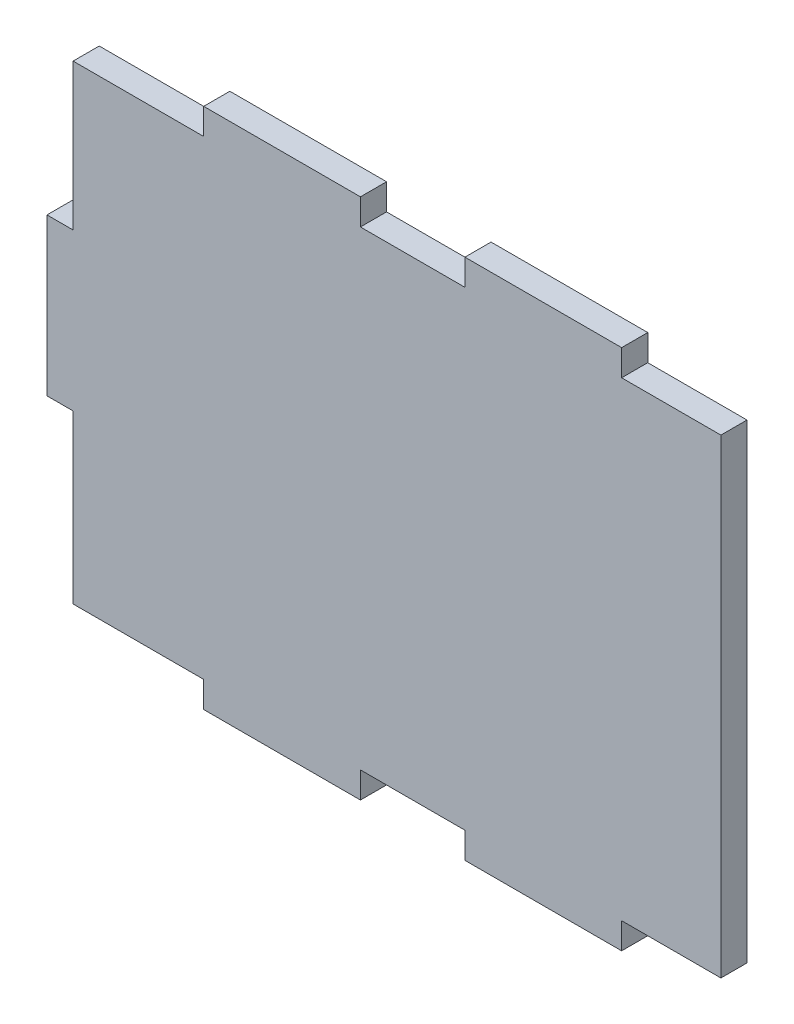
ISO-10303-21;
HEADER;
FILE_DESCRIPTION(('STEP AP214'),'2;1');
FILE_NAME('part.step','',(''),(''),'','','');
FILE_SCHEMA(('AUTOMOTIVE_DESIGN { 1 0 10303 214 1 1 1 1 }'));
ENDSEC;
DATA;
#1=APPLICATION_CONTEXT('core data for automotive mechanical design processes');
#2=APPLICATION_PROTOCOL_DEFINITION('international standard','automotive_design',2000,#1);
#3=PRODUCT_CONTEXT('',#1,'mechanical');
#4=PRODUCT('Part','Part','',(#3));
#5=PRODUCT_RELATED_PRODUCT_CATEGORY('part','',(#4));
#6=PRODUCT_DEFINITION_FORMATION('','',#4);
#7=PRODUCT_DEFINITION_CONTEXT('part definition',#1,'design');
#8=PRODUCT_DEFINITION('design','',#6,#7);
#9=PRODUCT_DEFINITION_SHAPE('','',#8);
#10=(LENGTH_UNIT() NAMED_UNIT(*) SI_UNIT(.MILLI.,.METRE.));
#11=(NAMED_UNIT(*) PLANE_ANGLE_UNIT() SI_UNIT($,.RADIAN.));
#12=(NAMED_UNIT(*) SI_UNIT($,.STERADIAN.) SOLID_ANGLE_UNIT());
#13=UNCERTAINTY_MEASURE_WITH_UNIT(LENGTH_MEASURE(1.E-05),#10,'distance_accuracy_value','');
#14=(GEOMETRIC_REPRESENTATION_CONTEXT(3) GLOBAL_UNCERTAINTY_ASSIGNED_CONTEXT((#13)) GLOBAL_UNIT_ASSIGNED_CONTEXT((#10,
#11,#12)) REPRESENTATION_CONTEXT('',''));
#15=CARTESIAN_POINT('',(0.,0.,0.));
#16=DIRECTION('',(0.,0.,1.));
#17=DIRECTION('',(1.,0.,0.));
#18=AXIS2_PLACEMENT_3D('',#15,#16,#17);
#19=CARTESIAN_POINT('',(-124.,155.000000000001,5.));
#20=DIRECTION('',(0.,1.,0.));
#21=DIRECTION('',(0.,0.,1.));
#22=AXIS2_PLACEMENT_3D('',#19,#20,#21);
#23=PLANE('',#22);
#24=DIRECTION('',(1.,0.,0.));
#25=VECTOR('',#24,1.);
#26=CARTESIAN_POINT('',(-124.,155.000000000001,0.));
#27=LINE('',#26,#25);
#28=CARTESIAN_POINT('',(-124.,155.000000000001,0.));
#29=VERTEX_POINT('',#28);
#30=CARTESIAN_POINT('',(-99.,155.000000000001,0.));
#31=VERTEX_POINT('',#30);
#32=EDGE_CURVE('E240',#29,#31,#27,.T.);
#33=ORIENTED_EDGE('',*,*,#32,.T.);
#34=DIRECTION('',(0.,0.,-1.));
#35=VECTOR('',#34,1.);
#36=CARTESIAN_POINT('',(-99.,155.000000000001,5.));
#37=LINE('',#36,#35);
#38=CARTESIAN_POINT('',(-99.,155.000000000001,5.));
#39=VERTEX_POINT('',#38);
#40=EDGE_CURVE('E11',#39,#31,#37,.T.);
#41=ORIENTED_EDGE('',*,*,#40,.F.);
#42=DIRECTION('',(1.,0.,0.));
#43=VECTOR('',#42,1.);
#44=CARTESIAN_POINT('',(-124.,155.000000000001,5.));
#45=LINE('',#44,#43);
#46=CARTESIAN_POINT('',(-124.,155.000000000001,5.));
#47=VERTEX_POINT('',#46);
#48=EDGE_CURVE('E310',#47,#39,#45,.T.);
#49=ORIENTED_EDGE('',*,*,#48,.F.);
#50=DIRECTION('',(0.,0.,-1.));
#51=VECTOR('',#50,1.);
#52=CARTESIAN_POINT('',(-124.,155.000000000001,5.));
#53=LINE('',#52,#51);
#54=EDGE_CURVE('E236',#47,#29,#53,.T.);
#55=ORIENTED_EDGE('',*,*,#54,.T.);
#56=EDGE_LOOP('',(#33,#41,#49,#55));
#57=FACE_BOUND('',#56,.T.);
#58=ADVANCED_FACE('F43',(#57),#23,.F.);
#59=CARTESIAN_POINT('',(-99.,155.000000000001,5.));
#60=DIRECTION('',(1.,0.,0.));
#61=DIRECTION('',(0.,0.,-1.));
#62=AXIS2_PLACEMENT_3D('',#59,#60,#61);
#63=PLANE('',#62);
#64=DIRECTION('',(0.,-1.,0.));
#65=VECTOR('',#64,1.);
#66=CARTESIAN_POINT('',(-99.,155.000000000001,0.));
#67=LINE('',#66,#65);
#68=CARTESIAN_POINT('',(-99.,150.000000000001,0.));
#69=VERTEX_POINT('',#68);
#70=EDGE_CURVE('E244',#31,#69,#67,.T.);
#71=ORIENTED_EDGE('',*,*,#70,.T.);
#72=DIRECTION('',(0.,0.,-1.));
#73=VECTOR('',#72,1.);
#74=CARTESIAN_POINT('',(-99.,150.000000000001,5.));
#75=LINE('',#74,#73);
#76=CARTESIAN_POINT('',(-99.,150.000000000001,5.));
#77=VERTEX_POINT('',#76);
#78=EDGE_CURVE('E52',#77,#69,#75,.T.);
#79=ORIENTED_EDGE('',*,*,#78,.F.);
#80=DIRECTION('',(0.,-1.,0.));
#81=VECTOR('',#80,1.);
#82=CARTESIAN_POINT('',(-99.,155.000000000001,5.));
#83=LINE('',#82,#81);
#84=EDGE_CURVE('E151',#39,#77,#83,.T.);
#85=ORIENTED_EDGE('',*,*,#84,.F.);
#86=ORIENTED_EDGE('',*,*,#40,.T.);
#87=EDGE_LOOP('',(#71,#79,#85,#86));
#88=FACE_BOUND('',#87,.T.);
#89=ADVANCED_FACE('F488',(#88),#63,.F.);
#90=CARTESIAN_POINT('',(-99.,150.000000000001,5.));
#91=DIRECTION('',(0.,1.,0.));
#92=DIRECTION('',(0.,0.,1.));
#93=AXIS2_PLACEMENT_3D('',#90,#91,#92);
#94=PLANE('',#93);
#95=DIRECTION('',(1.,0.,0.));
#96=VECTOR('',#95,1.);
#97=CARTESIAN_POINT('',(-99.,150.000000000001,0.));
#98=LINE('',#97,#96);
#99=CARTESIAN_POINT('',(-69.,150.000000000001,0.));
#100=VERTEX_POINT('',#99);
#101=EDGE_CURVE('E247',#69,#100,#98,.T.);
#102=ORIENTED_EDGE('',*,*,#101,.T.);
#103=DIRECTION('',(0.,0.,-1.));
#104=VECTOR('',#103,1.);
#105=CARTESIAN_POINT('',(-69.,150.000000000001,5.));
#106=LINE('',#105,#104);
#107=CARTESIAN_POINT('',(-69.,150.000000000001,5.));
#108=VERTEX_POINT('',#107);
#109=EDGE_CURVE('E385',#108,#100,#106,.T.);
#110=ORIENTED_EDGE('',*,*,#109,.F.);
#111=DIRECTION('',(1.,0.,0.));
#112=VECTOR('',#111,1.);
#113=CARTESIAN_POINT('',(-99.,150.000000000001,5.));
#114=LINE('',#113,#112);
#115=EDGE_CURVE('E395',#77,#108,#114,.T.);
#116=ORIENTED_EDGE('',*,*,#115,.F.);
#117=ORIENTED_EDGE('',*,*,#78,.T.);
#118=EDGE_LOOP('',(#102,#110,#116,#117));
#119=FACE_BOUND('',#118,.T.);
#120=ADVANCED_FACE('F393',(#119),#94,.F.);
#121=CARTESIAN_POINT('',(-69.,150.000000000001,5.));
#122=DIRECTION('',(-1.,0.,0.));
#123=DIRECTION('',(0.,0.,1.));
#124=AXIS2_PLACEMENT_3D('',#121,#122,#123);
#125=PLANE('',#124);
#126=DIRECTION('',(0.,1.,0.));
#127=VECTOR('',#126,1.);
#128=CARTESIAN_POINT('',(-69.,150.000000000001,0.));
#129=LINE('',#128,#127);
#130=CARTESIAN_POINT('',(-69.,155.000000000001,0.));
#131=VERTEX_POINT('',#130);
#132=EDGE_CURVE('E250',#100,#131,#129,.T.);
#133=ORIENTED_EDGE('',*,*,#132,.T.);
#134=DIRECTION('',(0.,0.,-1.));
#135=VECTOR('',#134,1.);
#136=CARTESIAN_POINT('',(-69.,155.000000000001,5.));
#137=LINE('',#136,#135);
#138=CARTESIAN_POINT('',(-69.,155.000000000001,5.));
#139=VERTEX_POINT('',#138);
#140=EDGE_CURVE('E381',#139,#131,#137,.T.);
#141=ORIENTED_EDGE('',*,*,#140,.F.);
#142=DIRECTION('',(0.,1.,0.));
#143=VECTOR('',#142,1.);
#144=CARTESIAN_POINT('',(-69.,150.000000000001,5.));
#145=LINE('',#144,#143);
#146=EDGE_CURVE('E414',#108,#139,#145,.T.);
#147=ORIENTED_EDGE('',*,*,#146,.F.);
#148=ORIENTED_EDGE('',*,*,#109,.T.);
#149=EDGE_LOOP('',(#133,#141,#147,#148));
#150=FACE_BOUND('',#149,.T.);
#151=ADVANCED_FACE('F404',(#150),#125,.F.);
#152=CARTESIAN_POINT('',(-69.,155.000000000001,5.));
#153=DIRECTION('',(0.,1.,0.));
#154=DIRECTION('',(0.,0.,1.));
#155=AXIS2_PLACEMENT_3D('',#152,#153,#154);
#156=PLANE('',#155);
#157=DIRECTION('',(1.,0.,0.));
#158=VECTOR('',#157,1.);
#159=CARTESIAN_POINT('',(-69.,155.000000000001,0.));
#160=LINE('',#159,#158);
#161=CARTESIAN_POINT('',(-49.,155.000000000001,0.));
#162=VERTEX_POINT('',#161);
#163=EDGE_CURVE('E253',#131,#162,#160,.T.);
#164=ORIENTED_EDGE('',*,*,#163,.T.);
#165=DIRECTION('',(0.,0.,-1.));
#166=VECTOR('',#165,1.);
#167=CARTESIAN_POINT('',(-49.,155.000000000001,5.));
#168=LINE('',#167,#166);
#169=CARTESIAN_POINT('',(-49.,155.000000000001,5.));
#170=VERTEX_POINT('',#169);
#171=EDGE_CURVE('E377',#170,#162,#168,.T.);
#172=ORIENTED_EDGE('',*,*,#171,.F.);
#173=DIRECTION('',(1.,0.,0.));
#174=VECTOR('',#173,1.);
#175=CARTESIAN_POINT('',(-69.,155.000000000001,5.));
#176=LINE('',#175,#174);
#177=EDGE_CURVE('E410',#139,#170,#176,.T.);
#178=ORIENTED_EDGE('',*,*,#177,.F.);
#179=ORIENTED_EDGE('',*,*,#140,.T.);
#180=EDGE_LOOP('',(#164,#172,#178,#179));
#181=FACE_BOUND('',#180,.T.);
#182=ADVANCED_FACE('F408',(#181),#156,.F.);
#183=CARTESIAN_POINT('',(-49.,155.000000000001,5.));
#184=DIRECTION('',(1.,0.,0.));
#185=DIRECTION('',(0.,0.,-1.));
#186=AXIS2_PLACEMENT_3D('',#183,#184,#185);
#187=PLANE('',#186);
#188=DIRECTION('',(0.,-1.,0.));
#189=VECTOR('',#188,1.);
#190=CARTESIAN_POINT('',(-49.,155.000000000001,0.));
#191=LINE('',#190,#189);
#192=CARTESIAN_POINT('',(-49.,150.000000000001,0.));
#193=VERTEX_POINT('',#192);
#194=EDGE_CURVE('E256',#162,#193,#191,.T.);
#195=ORIENTED_EDGE('',*,*,#194,.T.);
#196=DIRECTION('',(0.,0.,-1.));
#197=VECTOR('',#196,1.);
#198=CARTESIAN_POINT('',(-49.,150.000000000001,5.));
#199=LINE('',#198,#197);
#200=CARTESIAN_POINT('',(-49.,150.000000000001,5.));
#201=VERTEX_POINT('',#200);
#202=EDGE_CURVE('E373',#201,#193,#199,.T.);
#203=ORIENTED_EDGE('',*,*,#202,.F.);
#204=DIRECTION('',(0.,-1.,0.));
#205=VECTOR('',#204,1.);
#206=CARTESIAN_POINT('',(-49.,155.000000000001,5.));
#207=LINE('',#206,#205);
#208=EDGE_CURVE('E413',#170,#201,#207,.T.);
#209=ORIENTED_EDGE('',*,*,#208,.F.);
#210=ORIENTED_EDGE('',*,*,#171,.T.);
#211=EDGE_LOOP('',(#195,#203,#209,#210));
#212=FACE_BOUND('',#211,.T.);
#213=ADVANCED_FACE('F501',(#212),#187,.F.);
#214=CARTESIAN_POINT('',(-49.,150.000000000001,5.));
#215=DIRECTION('',(0.,1.,0.));
#216=DIRECTION('',(0.,0.,1.));
#217=AXIS2_PLACEMENT_3D('',#214,#215,#216);
#218=PLANE('',#217);
#219=DIRECTION('',(1.,0.,0.));
#220=VECTOR('',#219,1.);
#221=CARTESIAN_POINT('',(-49.,150.000000000001,0.));
#222=LINE('',#221,#220);
#223=CARTESIAN_POINT('',(-19.,150.000000000001,0.));
#224=VERTEX_POINT('',#223);
#225=EDGE_CURVE('E259',#193,#224,#222,.T.);
#226=ORIENTED_EDGE('',*,*,#225,.T.);
#227=DIRECTION('',(0.,0.,-1.));
#228=VECTOR('',#227,1.);
#229=CARTESIAN_POINT('',(-19.,150.000000000001,5.));
#230=LINE('',#229,#228);
#231=CARTESIAN_POINT('',(-19.,150.000000000001,5.));
#232=VERTEX_POINT('',#231);
#233=EDGE_CURVE('E369',#232,#224,#230,.T.);
#234=ORIENTED_EDGE('',*,*,#233,.F.);
#235=DIRECTION('',(1.,0.,0.));
#236=VECTOR('',#235,1.);
#237=CARTESIAN_POINT('',(-49.,150.000000000001,5.));
#238=LINE('',#237,#236);
#239=EDGE_CURVE('E418',#201,#232,#238,.T.);
#240=ORIENTED_EDGE('',*,*,#239,.F.);
#241=ORIENTED_EDGE('',*,*,#202,.T.);
#242=EDGE_LOOP('',(#226,#234,#240,#241));
#243=FACE_BOUND('',#242,.T.);
#244=ADVANCED_FACE('F504',(#243),#218,.F.);
#245=CARTESIAN_POINT('',(-19.,150.000000000001,5.));
#246=DIRECTION('',(-1.,0.,0.));
#247=DIRECTION('',(0.,0.,1.));
#248=AXIS2_PLACEMENT_3D('',#245,#246,#247);
#249=PLANE('',#248);
#250=DIRECTION('',(0.,1.,0.));
#251=VECTOR('',#250,1.);
#252=CARTESIAN_POINT('',(-19.,150.000000000001,0.));
#253=LINE('',#252,#251);
#254=CARTESIAN_POINT('',(-19.,155.000000000001,0.));
#255=VERTEX_POINT('',#254);
#256=EDGE_CURVE('E262',#224,#255,#253,.T.);
#257=ORIENTED_EDGE('',*,*,#256,.T.);
#258=DIRECTION('',(0.,0.,-1.));
#259=VECTOR('',#258,1.);
#260=CARTESIAN_POINT('',(-19.,155.000000000001,5.));
#261=LINE('',#260,#259);
#262=CARTESIAN_POINT('',(-19.,155.000000000001,5.));
#263=VERTEX_POINT('',#262);
#264=EDGE_CURVE('E365',#263,#255,#261,.T.);
#265=ORIENTED_EDGE('',*,*,#264,.F.);
#266=DIRECTION('',(0.,1.,0.));
#267=VECTOR('',#266,1.);
#268=CARTESIAN_POINT('',(-19.,150.000000000001,5.));
#269=LINE('',#268,#267);
#270=EDGE_CURVE('E425',#232,#263,#269,.T.);
#271=ORIENTED_EDGE('',*,*,#270,.F.);
#272=ORIENTED_EDGE('',*,*,#233,.T.);
#273=EDGE_LOOP('',(#257,#265,#271,#272));
#274=FACE_BOUND('',#273,.T.);
#275=ADVANCED_FACE('F508',(#274),#249,.F.);
#276=CARTESIAN_POINT('',(-19.,155.000000000001,5.));
#277=DIRECTION('',(0.,1.,0.));
#278=DIRECTION('',(0.,0.,1.));
#279=AXIS2_PLACEMENT_3D('',#276,#277,#278);
#280=PLANE('',#279);
#281=DIRECTION('',(1.,0.,0.));
#282=VECTOR('',#281,1.);
#283=CARTESIAN_POINT('',(-19.,155.000000000001,0.));
#284=LINE('',#283,#282);
#285=CARTESIAN_POINT('',(0.,155.000000000001,0.));
#286=VERTEX_POINT('',#285);
#287=EDGE_CURVE('E265',#255,#286,#284,.T.);
#288=ORIENTED_EDGE('',*,*,#287,.T.);
#289=DIRECTION('',(0.,0.,-1.));
#290=VECTOR('',#289,1.);
#291=CARTESIAN_POINT('',(0.,155.000000000001,5.));
#292=LINE('',#291,#290);
#293=CARTESIAN_POINT('',(0.,155.000000000001,5.));
#294=VERTEX_POINT('',#293);
#295=EDGE_CURVE('E361',#294,#286,#292,.T.);
#296=ORIENTED_EDGE('',*,*,#295,.F.);
#297=DIRECTION('',(1.,0.,0.));
#298=VECTOR('',#297,1.);
#299=CARTESIAN_POINT('',(-19.,155.000000000001,5.));
#300=LINE('',#299,#298);
#301=EDGE_CURVE('E428',#263,#294,#300,.T.);
#302=ORIENTED_EDGE('',*,*,#301,.F.);
#303=ORIENTED_EDGE('',*,*,#264,.T.);
#304=EDGE_LOOP('',(#288,#296,#302,#303));
#305=FACE_BOUND('',#304,.T.);
#306=ADVANCED_FACE('F512',(#305),#280,.F.);
#307=CARTESIAN_POINT('',(0.,155.000000000001,5.));
#308=DIRECTION('',(-1.,0.,0.));
#309=DIRECTION('',(0.,-1.,0.));
#310=AXIS2_PLACEMENT_3D('',#307,#308,#309);
#311=PLANE('',#310);
#312=DIRECTION('',(0.,1.,0.));
#313=VECTOR('',#312,1.);
#314=CARTESIAN_POINT('',(0.,155.000000000001,0.));
#315=LINE('',#314,#313);
#316=CARTESIAN_POINT('',(0.,244.999999999946,0.));
#317=VERTEX_POINT('',#316);
#318=EDGE_CURVE('E268',#286,#317,#315,.T.);
#319=ORIENTED_EDGE('',*,*,#318,.T.);
#320=DIRECTION('',(0.,0.,-1.));
#321=VECTOR('',#320,1.);
#322=CARTESIAN_POINT('',(0.,244.999999999946,5.));
#323=LINE('',#322,#321);
#324=CARTESIAN_POINT('',(0.,244.999999999946,5.));
#325=VERTEX_POINT('',#324);
#326=EDGE_CURVE('E357',#325,#317,#323,.T.);
#327=ORIENTED_EDGE('',*,*,#326,.F.);
#328=DIRECTION('',(0.,1.,0.));
#329=VECTOR('',#328,1.);
#330=CARTESIAN_POINT('',(0.,155.000000000001,5.));
#331=LINE('',#330,#329);
#332=EDGE_CURVE('E431',#294,#325,#331,.T.);
#333=ORIENTED_EDGE('',*,*,#332,.F.);
#334=ORIENTED_EDGE('',*,*,#295,.T.);
#335=EDGE_LOOP('',(#319,#327,#333,#334));
#336=FACE_BOUND('',#335,.T.);
#337=ADVANCED_FACE('F516',(#336),#311,.F.);
#338=CARTESIAN_POINT('',(0.,244.999999999946,5.));
#339=DIRECTION('',(0.,-1.,0.));
#340=DIRECTION('',(0.,0.,-1.));
#341=AXIS2_PLACEMENT_3D('',#338,#339,#340);
#342=PLANE('',#341);
#343=DIRECTION('',(-1.,0.,0.));
#344=VECTOR('',#343,1.);
#345=CARTESIAN_POINT('',(0.,244.999999999946,0.));
#346=LINE('',#345,#344);
#347=CARTESIAN_POINT('',(-19.,244.999999999946,0.));
#348=VERTEX_POINT('',#347);
#349=EDGE_CURVE('E271',#317,#348,#346,.T.);
#350=ORIENTED_EDGE('',*,*,#349,.T.);
#351=DIRECTION('',(0.,0.,-1.));
#352=VECTOR('',#351,1.);
#353=CARTESIAN_POINT('',(-19.,244.999999999946,5.));
#354=LINE('',#353,#352);
#355=CARTESIAN_POINT('',(-19.,244.999999999946,5.));
#356=VERTEX_POINT('',#355);
#357=EDGE_CURVE('E353',#356,#348,#354,.T.);
#358=ORIENTED_EDGE('',*,*,#357,.F.);
#359=DIRECTION('',(-1.,0.,0.));
#360=VECTOR('',#359,1.);
#361=CARTESIAN_POINT('',(0.,244.999999999946,5.));
#362=LINE('',#361,#360);
#363=EDGE_CURVE('E434',#325,#356,#362,.T.);
#364=ORIENTED_EDGE('',*,*,#363,.F.);
#365=ORIENTED_EDGE('',*,*,#326,.T.);
#366=EDGE_LOOP('',(#350,#358,#364,#365));
#367=FACE_BOUND('',#366,.T.);
#368=ADVANCED_FACE('F520',(#367),#342,.F.);
#369=CARTESIAN_POINT('',(-19.,244.999999999946,5.));
#370=DIRECTION('',(-1.,0.,0.));
#371=DIRECTION('',(0.,0.,1.));
#372=AXIS2_PLACEMENT_3D('',#369,#370,#371);
#373=PLANE('',#372);
#374=DIRECTION('',(0.,1.,0.));
#375=VECTOR('',#374,1.);
#376=CARTESIAN_POINT('',(-19.,244.999999999946,0.));
#377=LINE('',#376,#375);
#378=CARTESIAN_POINT('',(-19.,249.999999999946,0.));
#379=VERTEX_POINT('',#378);
#380=EDGE_CURVE('E274',#348,#379,#377,.T.);
#381=ORIENTED_EDGE('',*,*,#380,.T.);
#382=DIRECTION('',(0.,0.,-1.));
#383=VECTOR('',#382,1.);
#384=CARTESIAN_POINT('',(-19.,249.999999999946,5.));
#385=LINE('',#384,#383);
#386=CARTESIAN_POINT('',(-19.,249.999999999946,5.));
#387=VERTEX_POINT('',#386);
#388=EDGE_CURVE('E349',#387,#379,#385,.T.);
#389=ORIENTED_EDGE('',*,*,#388,.F.);
#390=DIRECTION('',(0.,1.,0.));
#391=VECTOR('',#390,1.);
#392=CARTESIAN_POINT('',(-19.,244.999999999946,5.));
#393=LINE('',#392,#391);
#394=EDGE_CURVE('E437',#356,#387,#393,.T.);
#395=ORIENTED_EDGE('',*,*,#394,.F.);
#396=ORIENTED_EDGE('',*,*,#357,.T.);
#397=EDGE_LOOP('',(#381,#389,#395,#396));
#398=FACE_BOUND('',#397,.T.);
#399=ADVANCED_FACE('F524',(#398),#373,.F.);
#400=CARTESIAN_POINT('',(-19.,249.999999999946,5.));
#401=DIRECTION('',(0.,-1.,0.));
#402=DIRECTION('',(0.,0.,-1.));
#403=AXIS2_PLACEMENT_3D('',#400,#401,#402);
#404=PLANE('',#403);
#405=DIRECTION('',(-1.,0.,0.));
#406=VECTOR('',#405,1.);
#407=CARTESIAN_POINT('',(-19.,249.999999999946,0.));
#408=LINE('',#407,#406);
#409=CARTESIAN_POINT('',(-49.,249.999999999946,0.));
#410=VERTEX_POINT('',#409);
#411=EDGE_CURVE('E277',#379,#410,#408,.T.);
#412=ORIENTED_EDGE('',*,*,#411,.T.);
#413=DIRECTION('',(0.,0.,-1.));
#414=VECTOR('',#413,1.);
#415=CARTESIAN_POINT('',(-49.,249.999999999946,5.));
#416=LINE('',#415,#414);
#417=CARTESIAN_POINT('',(-49.,249.999999999946,5.));
#418=VERTEX_POINT('',#417);
#419=EDGE_CURVE('E345',#418,#410,#416,.T.);
#420=ORIENTED_EDGE('',*,*,#419,.F.);
#421=DIRECTION('',(-1.,0.,0.));
#422=VECTOR('',#421,1.);
#423=CARTESIAN_POINT('',(-19.,249.999999999946,5.));
#424=LINE('',#423,#422);
#425=EDGE_CURVE('E440',#387,#418,#424,.T.);
#426=ORIENTED_EDGE('',*,*,#425,.F.);
#427=ORIENTED_EDGE('',*,*,#388,.T.);
#428=EDGE_LOOP('',(#412,#420,#426,#427));
#429=FACE_BOUND('',#428,.T.);
#430=ADVANCED_FACE('F528',(#429),#404,.F.);
#431=CARTESIAN_POINT('',(-49.,249.999999999946,5.));
#432=DIRECTION('',(1.,0.,0.));
#433=DIRECTION('',(0.,0.,-1.));
#434=AXIS2_PLACEMENT_3D('',#431,#432,#433);
#435=PLANE('',#434);
#436=DIRECTION('',(0.,-1.,0.));
#437=VECTOR('',#436,1.);
#438=CARTESIAN_POINT('',(-49.,249.999999999946,0.));
#439=LINE('',#438,#437);
#440=CARTESIAN_POINT('',(-49.,244.999999999946,0.));
#441=VERTEX_POINT('',#440);
#442=EDGE_CURVE('E280',#410,#441,#439,.T.);
#443=ORIENTED_EDGE('',*,*,#442,.T.);
#444=DIRECTION('',(0.,0.,-1.));
#445=VECTOR('',#444,1.);
#446=CARTESIAN_POINT('',(-49.,244.999999999946,5.));
#447=LINE('',#446,#445);
#448=CARTESIAN_POINT('',(-49.,244.999999999946,5.));
#449=VERTEX_POINT('',#448);
#450=EDGE_CURVE('E341',#449,#441,#447,.T.);
#451=ORIENTED_EDGE('',*,*,#450,.F.);
#452=DIRECTION('',(0.,-1.,0.));
#453=VECTOR('',#452,1.);
#454=CARTESIAN_POINT('',(-49.,249.999999999946,5.));
#455=LINE('',#454,#453);
#456=EDGE_CURVE('E443',#418,#449,#455,.T.);
#457=ORIENTED_EDGE('',*,*,#456,.F.);
#458=ORIENTED_EDGE('',*,*,#419,.T.);
#459=EDGE_LOOP('',(#443,#451,#457,#458));
#460=FACE_BOUND('',#459,.T.);
#461=ADVANCED_FACE('F532',(#460),#435,.F.);
#462=CARTESIAN_POINT('',(-49.,244.999999999946,5.));
#463=DIRECTION('',(0.,-1.,0.));
#464=DIRECTION('',(0.,0.,-1.));
#465=AXIS2_PLACEMENT_3D('',#462,#463,#464);
#466=PLANE('',#465);
#467=DIRECTION('',(-1.,0.,0.));
#468=VECTOR('',#467,1.);
#469=CARTESIAN_POINT('',(-49.,244.999999999946,0.));
#470=LINE('',#469,#468);
#471=CARTESIAN_POINT('',(-69.,244.999999999946,0.));
#472=VERTEX_POINT('',#471);
#473=EDGE_CURVE('E283',#441,#472,#470,.T.);
#474=ORIENTED_EDGE('',*,*,#473,.T.);
#475=DIRECTION('',(0.,0.,-1.));
#476=VECTOR('',#475,1.);
#477=CARTESIAN_POINT('',(-69.,244.999999999946,5.));
#478=LINE('',#477,#476);
#479=CARTESIAN_POINT('',(-69.,244.999999999946,5.));
#480=VERTEX_POINT('',#479);
#481=EDGE_CURVE('E337',#480,#472,#478,.T.);
#482=ORIENTED_EDGE('',*,*,#481,.F.);
#483=DIRECTION('',(-1.,0.,0.));
#484=VECTOR('',#483,1.);
#485=CARTESIAN_POINT('',(-49.,244.999999999946,5.));
#486=LINE('',#485,#484);
#487=EDGE_CURVE('E446',#449,#480,#486,.T.);
#488=ORIENTED_EDGE('',*,*,#487,.F.);
#489=ORIENTED_EDGE('',*,*,#450,.T.);
#490=EDGE_LOOP('',(#474,#482,#488,#489));
#491=FACE_BOUND('',#490,.T.);
#492=ADVANCED_FACE('F536',(#491),#466,.F.);
#493=CARTESIAN_POINT('',(-69.,244.999999999946,5.));
#494=DIRECTION('',(-1.,0.,0.));
#495=DIRECTION('',(0.,0.,1.));
#496=AXIS2_PLACEMENT_3D('',#493,#494,#495);
#497=PLANE('',#496);
#498=DIRECTION('',(0.,1.,0.));
#499=VECTOR('',#498,1.);
#500=CARTESIAN_POINT('',(-69.,244.999999999946,0.));
#501=LINE('',#500,#499);
#502=CARTESIAN_POINT('',(-69.,249.999999999946,0.));
#503=VERTEX_POINT('',#502);
#504=EDGE_CURVE('E286',#472,#503,#501,.T.);
#505=ORIENTED_EDGE('',*,*,#504,.T.);
#506=DIRECTION('',(0.,0.,-1.));
#507=VECTOR('',#506,1.);
#508=CARTESIAN_POINT('',(-69.,249.999999999946,5.));
#509=LINE('',#508,#507);
#510=CARTESIAN_POINT('',(-69.,249.999999999946,5.));
#511=VERTEX_POINT('',#510);
#512=EDGE_CURVE('E333',#511,#503,#509,.T.);
#513=ORIENTED_EDGE('',*,*,#512,.F.);
#514=DIRECTION('',(0.,1.,0.));
#515=VECTOR('',#514,1.);
#516=CARTESIAN_POINT('',(-69.,244.999999999946,5.));
#517=LINE('',#516,#515);
#518=EDGE_CURVE('E449',#480,#511,#517,.T.);
#519=ORIENTED_EDGE('',*,*,#518,.F.);
#520=ORIENTED_EDGE('',*,*,#481,.T.);
#521=EDGE_LOOP('',(#505,#513,#519,#520));
#522=FACE_BOUND('',#521,.T.);
#523=ADVANCED_FACE('F540',(#522),#497,.F.);
#524=CARTESIAN_POINT('',(-69.,249.999999999946,5.));
#525=DIRECTION('',(0.,-1.,0.));
#526=DIRECTION('',(0.,0.,-1.));
#527=AXIS2_PLACEMENT_3D('',#524,#525,#526);
#528=PLANE('',#527);
#529=DIRECTION('',(-1.,0.,0.));
#530=VECTOR('',#529,1.);
#531=CARTESIAN_POINT('',(-69.,249.999999999946,0.));
#532=LINE('',#531,#530);
#533=CARTESIAN_POINT('',(-99.,249.999999999946,0.));
#534=VERTEX_POINT('',#533);
#535=EDGE_CURVE('E289',#503,#534,#532,.T.);
#536=ORIENTED_EDGE('',*,*,#535,.T.);
#537=DIRECTION('',(0.,0.,-1.));
#538=VECTOR('',#537,1.);
#539=CARTESIAN_POINT('',(-99.,249.999999999946,5.));
#540=LINE('',#539,#538);
#541=CARTESIAN_POINT('',(-99.,249.999999999946,5.));
#542=VERTEX_POINT('',#541);
#543=EDGE_CURVE('E329',#542,#534,#540,.T.);
#544=ORIENTED_EDGE('',*,*,#543,.F.);
#545=DIRECTION('',(-1.,0.,0.));
#546=VECTOR('',#545,1.);
#547=CARTESIAN_POINT('',(-69.,249.999999999946,5.));
#548=LINE('',#547,#546);
#549=EDGE_CURVE('E452',#511,#542,#548,.T.);
#550=ORIENTED_EDGE('',*,*,#549,.F.);
#551=ORIENTED_EDGE('',*,*,#512,.T.);
#552=EDGE_LOOP('',(#536,#544,#550,#551));
#553=FACE_BOUND('',#552,.T.);
#554=ADVANCED_FACE('F544',(#553),#528,.F.);
#555=CARTESIAN_POINT('',(-99.,249.999999999946,5.));
#556=DIRECTION('',(1.,0.,0.));
#557=DIRECTION('',(0.,0.,-1.));
#558=AXIS2_PLACEMENT_3D('',#555,#556,#557);
#559=PLANE('',#558);
#560=DIRECTION('',(0.,-1.,0.));
#561=VECTOR('',#560,1.);
#562=CARTESIAN_POINT('',(-99.,249.999999999946,0.));
#563=LINE('',#562,#561);
#564=CARTESIAN_POINT('',(-99.,244.999999999946,0.));
#565=VERTEX_POINT('',#564);
#566=EDGE_CURVE('E292',#534,#565,#563,.T.);
#567=ORIENTED_EDGE('',*,*,#566,.T.);
#568=DIRECTION('',(0.,0.,-1.));
#569=VECTOR('',#568,1.);
#570=CARTESIAN_POINT('',(-99.,244.999999999946,5.));
#571=LINE('',#570,#569);
#572=CARTESIAN_POINT('',(-99.,244.999999999946,5.));
#573=VERTEX_POINT('',#572);
#574=EDGE_CURVE('E325',#573,#565,#571,.T.);
#575=ORIENTED_EDGE('',*,*,#574,.F.);
#576=DIRECTION('',(0.,-1.,0.));
#577=VECTOR('',#576,1.);
#578=CARTESIAN_POINT('',(-99.,249.999999999946,5.));
#579=LINE('',#578,#577);
#580=EDGE_CURVE('E455',#542,#573,#579,.T.);
#581=ORIENTED_EDGE('',*,*,#580,.F.);
#582=ORIENTED_EDGE('',*,*,#543,.T.);
#583=EDGE_LOOP('',(#567,#575,#581,#582));
#584=FACE_BOUND('',#583,.T.);
#585=ADVANCED_FACE('F548',(#584),#559,.F.);
#586=CARTESIAN_POINT('',(-99.,244.999999999946,5.));
#587=DIRECTION('',(0.,-1.,0.));
#588=DIRECTION('',(0.,0.,-1.));
#589=AXIS2_PLACEMENT_3D('',#586,#587,#588);
#590=PLANE('',#589);
#591=DIRECTION('',(-1.,0.,0.));
#592=VECTOR('',#591,1.);
#593=CARTESIAN_POINT('',(-99.,244.999999999946,0.));
#594=LINE('',#593,#592);
#595=CARTESIAN_POINT('',(-124.,244.999999999946,0.));
#596=VERTEX_POINT('',#595);
#597=EDGE_CURVE('E295',#565,#596,#594,.T.);
#598=ORIENTED_EDGE('',*,*,#597,.T.);
#599=DIRECTION('',(0.,0.,-1.));
#600=VECTOR('',#599,1.);
#601=CARTESIAN_POINT('',(-124.,244.999999999946,5.));
#602=LINE('',#601,#600);
#603=CARTESIAN_POINT('',(-124.,244.999999999946,5.));
#604=VERTEX_POINT('',#603);
#605=EDGE_CURVE('E321',#604,#596,#602,.T.);
#606=ORIENTED_EDGE('',*,*,#605,.F.);
#607=DIRECTION('',(-1.,0.,0.));
#608=VECTOR('',#607,1.);
#609=CARTESIAN_POINT('',(-99.,244.999999999946,5.));
#610=LINE('',#609,#608);
#611=EDGE_CURVE('E458',#573,#604,#610,.T.);
#612=ORIENTED_EDGE('',*,*,#611,.F.);
#613=ORIENTED_EDGE('',*,*,#574,.T.);
#614=EDGE_LOOP('',(#598,#606,#612,#613));
#615=FACE_BOUND('',#614,.T.);
#616=ADVANCED_FACE('F552',(#615),#590,.F.);
#617=CARTESIAN_POINT('',(-124.,244.999999999946,5.));
#618=DIRECTION('',(1.,0.,0.));
#619=DIRECTION('',(0.,0.,-1.));
#620=AXIS2_PLACEMENT_3D('',#617,#618,#619);
#621=PLANE('',#620);
#622=DIRECTION('',(0.,-1.,0.));
#623=VECTOR('',#622,1.);
#624=CARTESIAN_POINT('',(-124.,244.999999999946,0.));
#625=LINE('',#624,#623);
#626=CARTESIAN_POINT('',(-124.,217.000000000001,0.));
#627=VERTEX_POINT('',#626);
#628=EDGE_CURVE('E298',#596,#627,#625,.T.);
#629=ORIENTED_EDGE('',*,*,#628,.T.);
#630=DIRECTION('',(0.,0.,-1.));
#631=VECTOR('',#630,1.);
#632=CARTESIAN_POINT('',(-124.,217.000000000001,5.));
#633=LINE('',#632,#631);
#634=CARTESIAN_POINT('',(-124.,217.000000000001,5.));
#635=VERTEX_POINT('',#634);
#636=EDGE_CURVE('E317',#635,#627,#633,.T.);
#637=ORIENTED_EDGE('',*,*,#636,.F.);
#638=DIRECTION('',(0.,-1.,0.));
#639=VECTOR('',#638,1.);
#640=CARTESIAN_POINT('',(-124.,244.999999999946,5.));
#641=LINE('',#640,#639);
#642=EDGE_CURVE('E461',#604,#635,#641,.T.);
#643=ORIENTED_EDGE('',*,*,#642,.F.);
#644=ORIENTED_EDGE('',*,*,#605,.T.);
#645=EDGE_LOOP('',(#629,#637,#643,#644));
#646=FACE_BOUND('',#645,.T.);
#647=ADVANCED_FACE('F469',(#646),#621,.F.);
#648=CARTESIAN_POINT('',(-124.,217.000000000001,5.));
#649=DIRECTION('',(0.,-1.,0.));
#650=DIRECTION('',(0.,0.,-1.));
#651=AXIS2_PLACEMENT_3D('',#648,#649,#650);
#652=PLANE('',#651);
#653=DIRECTION('',(-1.,0.,0.));
#654=VECTOR('',#653,1.);
#655=CARTESIAN_POINT('',(-124.,217.000000000001,0.));
#656=LINE('',#655,#654);
#657=CARTESIAN_POINT('',(-129.,217.000000000001,0.));
#658=VERTEX_POINT('',#657);
#659=EDGE_CURVE('E301',#627,#658,#656,.T.);
#660=ORIENTED_EDGE('',*,*,#659,.T.);
#661=DIRECTION('',(0.,0.,-1.));
#662=VECTOR('',#661,1.);
#663=CARTESIAN_POINT('',(-129.,217.000000000001,5.));
#664=LINE('',#663,#662);
#665=CARTESIAN_POINT('',(-129.,217.000000000001,5.));
#666=VERTEX_POINT('',#665);
#667=EDGE_CURVE('E229',#666,#658,#664,.T.);
#668=ORIENTED_EDGE('',*,*,#667,.F.);
#669=DIRECTION('',(-1.,0.,0.));
#670=VECTOR('',#669,1.);
#671=CARTESIAN_POINT('',(-124.,217.000000000001,5.));
#672=LINE('',#671,#670);
#673=EDGE_CURVE('E218',#635,#666,#672,.T.);
#674=ORIENTED_EDGE('',*,*,#673,.F.);
#675=ORIENTED_EDGE('',*,*,#636,.T.);
#676=EDGE_LOOP('',(#660,#668,#674,#675));
#677=FACE_BOUND('',#676,.T.);
#678=ADVANCED_FACE('F473',(#677),#652,.F.);
#679=CARTESIAN_POINT('',(-129.,217.000000000001,5.));
#680=DIRECTION('',(1.,0.,0.));
#681=DIRECTION('',(0.,0.,-1.));
#682=AXIS2_PLACEMENT_3D('',#679,#680,#681);
#683=PLANE('',#682);
#684=DIRECTION('',(0.,-1.,0.));
#685=VECTOR('',#684,1.);
#686=CARTESIAN_POINT('',(-129.,217.000000000001,0.));
#687=LINE('',#686,#685);
#688=CARTESIAN_POINT('',(-129.,187.000000000001,0.));
#689=VERTEX_POINT('',#688);
#690=EDGE_CURVE('E227',#658,#689,#687,.T.);
#691=ORIENTED_EDGE('',*,*,#690,.T.);
#692=DIRECTION('',(0.,0.,-1.));
#693=VECTOR('',#692,1.);
#694=CARTESIAN_POINT('',(-129.,187.000000000001,5.));
#695=LINE('',#694,#693);
#696=CARTESIAN_POINT('',(-129.,187.000000000001,5.));
#697=VERTEX_POINT('',#696);
#698=EDGE_CURVE('E224',#697,#689,#695,.T.);
#699=ORIENTED_EDGE('',*,*,#698,.F.);
#700=DIRECTION('',(0.,-1.,0.));
#701=VECTOR('',#700,1.);
#702=CARTESIAN_POINT('',(-129.,217.000000000001,5.));
#703=LINE('',#702,#701);
#704=EDGE_CURVE('E212',#666,#697,#703,.T.);
#705=ORIENTED_EDGE('',*,*,#704,.F.);
#706=ORIENTED_EDGE('',*,*,#667,.T.);
#707=EDGE_LOOP('',(#691,#699,#705,#706));
#708=FACE_BOUND('',#707,.T.);
#709=ADVANCED_FACE('F225',(#708),#683,.F.);
#710=CARTESIAN_POINT('',(-129.,187.000000000001,5.));
#711=DIRECTION('',(0.,1.,0.));
#712=DIRECTION('',(0.,0.,1.));
#713=AXIS2_PLACEMENT_3D('',#710,#711,#712);
#714=PLANE('',#713);
#715=DIRECTION('',(1.,0.,0.));
#716=VECTOR('',#715,1.);
#717=CARTESIAN_POINT('',(-129.,187.000000000001,0.));
#718=LINE('',#717,#716);
#719=CARTESIAN_POINT('',(-124.,187.000000000001,0.));
#720=VERTEX_POINT('',#719);
#721=EDGE_CURVE('E137',#689,#720,#718,.T.);
#722=ORIENTED_EDGE('',*,*,#721,.T.);
#723=DIRECTION('',(0.,0.,-1.));
#724=VECTOR('',#723,1.);
#725=CARTESIAN_POINT('',(-124.,187.000000000001,5.));
#726=LINE('',#725,#724);
#727=CARTESIAN_POINT('',(-124.,187.000000000001,5.));
#728=VERTEX_POINT('',#727);
#729=EDGE_CURVE('E230',#728,#720,#726,.T.);
#730=ORIENTED_EDGE('',*,*,#729,.F.);
#731=DIRECTION('',(1.,0.,0.));
#732=VECTOR('',#731,1.);
#733=CARTESIAN_POINT('',(-129.,187.000000000001,5.));
#734=LINE('',#733,#732);
#735=EDGE_CURVE('E216',#697,#728,#734,.T.);
#736=ORIENTED_EDGE('',*,*,#735,.F.);
#737=ORIENTED_EDGE('',*,*,#698,.T.);
#738=EDGE_LOOP('',(#722,#730,#736,#737));
#739=FACE_BOUND('',#738,.T.);
#740=ADVANCED_FACE('F232',(#739),#714,.F.);
#741=CARTESIAN_POINT('',(-124.,155.000000000001,5.));
#742=DIRECTION('',(1.,0.,0.));
#743=DIRECTION('',(0.,0.,-1.));
#744=AXIS2_PLACEMENT_3D('',#741,#742,#743);
#745=PLANE('',#744);
#746=DIRECTION('',(0.,-1.,0.));
#747=VECTOR('',#746,1.);
#748=CARTESIAN_POINT('',(-124.,155.000000000001,0.));
#749=LINE('',#748,#747);
#750=EDGE_CURVE('E143',#720,#29,#749,.T.);
#751=ORIENTED_EDGE('',*,*,#750,.T.);
#752=ORIENTED_EDGE('',*,*,#54,.F.);
#753=DIRECTION('',(0.,-1.,0.));
#754=VECTOR('',#753,1.);
#755=CARTESIAN_POINT('',(-124.,155.000000000001,5.));
#756=LINE('',#755,#754);
#757=EDGE_CURVE('E60',#728,#47,#756,.T.);
#758=ORIENTED_EDGE('',*,*,#757,.F.);
#759=ORIENTED_EDGE('',*,*,#729,.T.);
#760=EDGE_LOOP('',(#751,#752,#758,#759));
#761=FACE_BOUND('',#760,.T.);
#762=ADVANCED_FACE('F477',(#761),#745,.F.);
#763=CARTESIAN_POINT('',(0.,0.,5.));
#764=DIRECTION('',(0.,0.,-1.));
#765=DIRECTION('',(-1.,0.,0.));
#766=AXIS2_PLACEMENT_3D('',#763,#764,#765);
#767=PLANE('',#766);
#768=ORIENTED_EDGE('',*,*,#48,.T.);
#769=ORIENTED_EDGE('',*,*,#84,.T.);
#770=ORIENTED_EDGE('',*,*,#115,.T.);
#771=ORIENTED_EDGE('',*,*,#146,.T.);
#772=ORIENTED_EDGE('',*,*,#177,.T.);
#773=ORIENTED_EDGE('',*,*,#208,.T.);
#774=ORIENTED_EDGE('',*,*,#239,.T.);
#775=ORIENTED_EDGE('',*,*,#270,.T.);
#776=ORIENTED_EDGE('',*,*,#301,.T.);
#777=ORIENTED_EDGE('',*,*,#332,.T.);
#778=ORIENTED_EDGE('',*,*,#363,.T.);
#779=ORIENTED_EDGE('',*,*,#394,.T.);
#780=ORIENTED_EDGE('',*,*,#425,.T.);
#781=ORIENTED_EDGE('',*,*,#456,.T.);
#782=ORIENTED_EDGE('',*,*,#487,.T.);
#783=ORIENTED_EDGE('',*,*,#518,.T.);
#784=ORIENTED_EDGE('',*,*,#549,.T.);
#785=ORIENTED_EDGE('',*,*,#580,.T.);
#786=ORIENTED_EDGE('',*,*,#611,.T.);
#787=ORIENTED_EDGE('',*,*,#642,.T.);
#788=ORIENTED_EDGE('',*,*,#673,.T.);
#789=ORIENTED_EDGE('',*,*,#704,.T.);
#790=ORIENTED_EDGE('',*,*,#735,.T.);
#791=ORIENTED_EDGE('',*,*,#757,.T.);
#792=EDGE_LOOP('',(#768,#769,#770,#771,#772,#773,#774,#775,#776,#777,#778,#779,#780,#781,#782,
#783,#784,#785,#786,#787,#788,#789,#790,#791));
#793=FACE_BOUND('',#792,.T.);
#794=ADVANCED_FACE('F214',(#793),#767,.F.);
#795=CARTESIAN_POINT('',(0.,0.,0.));
#796=DIRECTION('',(0.,0.,-1.));
#797=DIRECTION('',(-1.,0.,0.));
#798=AXIS2_PLACEMENT_3D('',#795,#796,#797);
#799=PLANE('',#798);
#800=ORIENTED_EDGE('',*,*,#32,.F.);
#801=ORIENTED_EDGE('',*,*,#750,.F.);
#802=ORIENTED_EDGE('',*,*,#721,.F.);
#803=ORIENTED_EDGE('',*,*,#690,.F.);
#804=ORIENTED_EDGE('',*,*,#659,.F.);
#805=ORIENTED_EDGE('',*,*,#628,.F.);
#806=ORIENTED_EDGE('',*,*,#597,.F.);
#807=ORIENTED_EDGE('',*,*,#566,.F.);
#808=ORIENTED_EDGE('',*,*,#535,.F.);
#809=ORIENTED_EDGE('',*,*,#504,.F.);
#810=ORIENTED_EDGE('',*,*,#473,.F.);
#811=ORIENTED_EDGE('',*,*,#442,.F.);
#812=ORIENTED_EDGE('',*,*,#411,.F.);
#813=ORIENTED_EDGE('',*,*,#380,.F.);
#814=ORIENTED_EDGE('',*,*,#349,.F.);
#815=ORIENTED_EDGE('',*,*,#318,.F.);
#816=ORIENTED_EDGE('',*,*,#287,.F.);
#817=ORIENTED_EDGE('',*,*,#256,.F.);
#818=ORIENTED_EDGE('',*,*,#225,.F.);
#819=ORIENTED_EDGE('',*,*,#194,.F.);
#820=ORIENTED_EDGE('',*,*,#163,.F.);
#821=ORIENTED_EDGE('',*,*,#132,.F.);
#822=ORIENTED_EDGE('',*,*,#101,.F.);
#823=ORIENTED_EDGE('',*,*,#70,.F.);
#824=EDGE_LOOP('',(#800,#801,#802,#803,#804,#805,#806,#807,#808,#809,#810,#811,#812,#813,#814,
#815,#816,#817,#818,#819,#820,#821,#822,#823));
#825=FACE_BOUND('',#824,.T.);
#826=ADVANCED_FACE('F399',(#825),#799,.T.);
#827=CLOSED_SHELL('',(#58,#89,#120,#151,#182,#213,#244,#275,#306,#337,#368,#399,#430,#461,#492,
#523,#554,#585,#616,#647,#678,#709,#740,#762,#794,#826));
#828=MANIFOLD_SOLID_BREP('B2',#827);
#829=ADVANCED_BREP_SHAPE_REPRESENTATION('',(#18,#828),#14);
#830=SHAPE_DEFINITION_REPRESENTATION(#9,#829);
ENDSEC;
END-ISO-10303-21;
